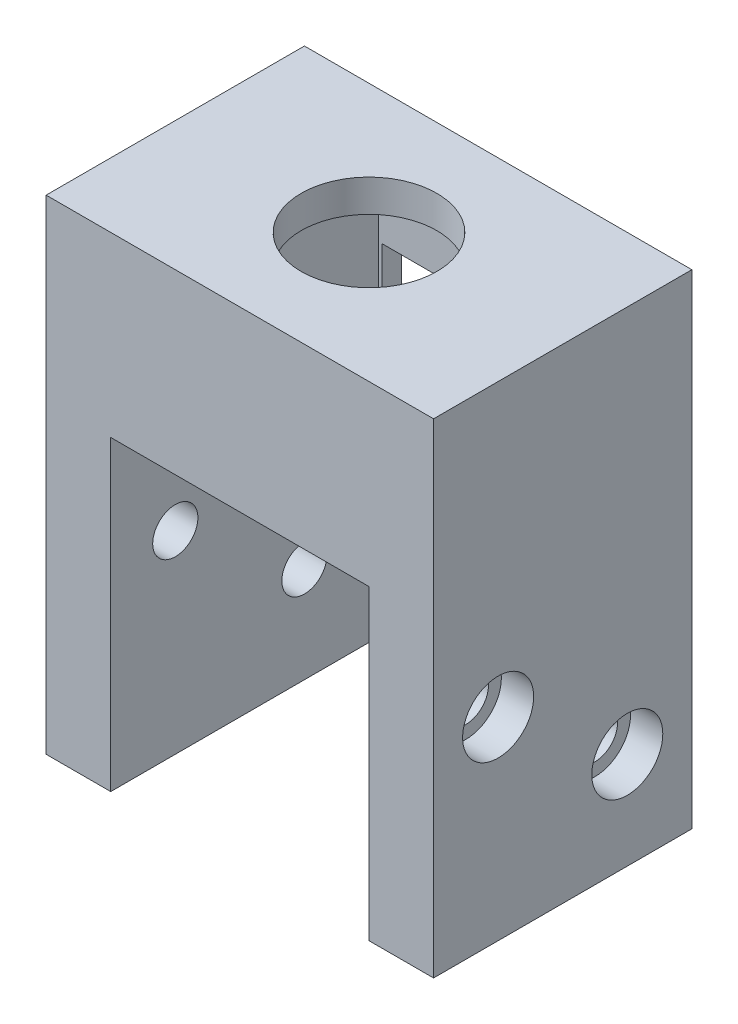
ISO-10303-21;
HEADER;
FILE_DESCRIPTION(('STEP AP214'),'2;1');
FILE_NAME('part.step','',(''),(''),'','','');
FILE_SCHEMA(('AUTOMOTIVE_DESIGN { 1 0 10303 214 1 1 1 1 }'));
ENDSEC;
DATA;
#1=APPLICATION_CONTEXT('core data for automotive mechanical design processes');
#2=APPLICATION_PROTOCOL_DEFINITION('international standard','automotive_design',2000,#1);
#3=PRODUCT_CONTEXT('',#1,'mechanical');
#4=PRODUCT('Part','Part','',(#3));
#5=PRODUCT_RELATED_PRODUCT_CATEGORY('part','',(#4));
#6=PRODUCT_DEFINITION_FORMATION('','',#4);
#7=PRODUCT_DEFINITION_CONTEXT('part definition',#1,'design');
#8=PRODUCT_DEFINITION('design','',#6,#7);
#9=PRODUCT_DEFINITION_SHAPE('','',#8);
#10=(LENGTH_UNIT() NAMED_UNIT(*) SI_UNIT(.MILLI.,.METRE.));
#11=(NAMED_UNIT(*) PLANE_ANGLE_UNIT() SI_UNIT($,.RADIAN.));
#12=(NAMED_UNIT(*) SI_UNIT($,.STERADIAN.) SOLID_ANGLE_UNIT());
#13=UNCERTAINTY_MEASURE_WITH_UNIT(LENGTH_MEASURE(1.E-05),#10,'distance_accuracy_value','');
#14=(GEOMETRIC_REPRESENTATION_CONTEXT(3) GLOBAL_UNCERTAINTY_ASSIGNED_CONTEXT((#13)) GLOBAL_UNIT_ASSIGNED_CONTEXT((#10,
#11,#12)) REPRESENTATION_CONTEXT('',''));
#15=CARTESIAN_POINT('',(0.,0.,0.));
#16=DIRECTION('',(0.,0.,1.));
#17=DIRECTION('',(1.,0.,0.));
#18=AXIS2_PLACEMENT_3D('',#15,#16,#17);
#19=CARTESIAN_POINT('',(-6.,-11.,-2.));
#20=DIRECTION('',(1.,0.,0.));
#21=DIRECTION('',(0.,0.,-1.));
#22=AXIS2_PLACEMENT_3D('',#19,#20,#21);
#23=CYLINDRICAL_SURFACE('',#22,0.699999999999999);
#24=CARTESIAN_POINT('',(4.,-11.,-2.));
#25=DIRECTION('',(-1.,0.,0.));
#26=DIRECTION('',(0.,0.,1.));
#27=AXIS2_PLACEMENT_3D('',#24,#25,#26);
#28=CIRCLE('',#27,0.699999999999999);
#29=CARTESIAN_POINT('',(4.,-11.,-1.3));
#30=VERTEX_POINT('',#29);
#31=EDGE_CURVE('E265',#30,#30,#28,.T.);
#32=ORIENTED_EDGE('',*,*,#31,.T.);
#33=EDGE_LOOP('',(#32));
#34=FACE_BOUND('',#33,.T.);
#35=CARTESIAN_POINT('',(5.,-11.,-2.));
#36=DIRECTION('',(1.,0.,0.));
#37=DIRECTION('',(0.,0.,-1.));
#38=AXIS2_PLACEMENT_3D('',#35,#36,#37);
#39=CIRCLE('',#38,0.699999999999999);
#40=CARTESIAN_POINT('',(5.,-11.,-2.7));
#41=VERTEX_POINT('',#40);
#42=EDGE_CURVE('E262',#41,#41,#39,.F.);
#43=ORIENTED_EDGE('',*,*,#42,.F.);
#44=EDGE_LOOP('',(#43));
#45=FACE_BOUND('',#44,.T.);
#46=ADVANCED_FACE('F50',(#34,#45),#23,.F.);
#47=CARTESIAN_POINT('',(-6.,-8.,2.));
#48=DIRECTION('',(1.,0.,0.));
#49=DIRECTION('',(0.,0.,-1.));
#50=AXIS2_PLACEMENT_3D('',#47,#48,#49);
#51=CYLINDRICAL_SURFACE('',#50,0.7);
#52=CARTESIAN_POINT('',(4.,-8.,2.));
#53=DIRECTION('',(-1.,0.,0.));
#54=DIRECTION('',(0.,0.,1.));
#55=AXIS2_PLACEMENT_3D('',#52,#53,#54);
#56=CIRCLE('',#55,0.7);
#57=CARTESIAN_POINT('',(4.,-8.,2.7));
#58=VERTEX_POINT('',#57);
#59=EDGE_CURVE('E302',#58,#58,#56,.T.);
#60=ORIENTED_EDGE('',*,*,#59,.T.);
#61=EDGE_LOOP('',(#60));
#62=FACE_BOUND('',#61,.T.);
#63=CARTESIAN_POINT('',(5.,-8.,2.));
#64=DIRECTION('',(1.,0.,0.));
#65=DIRECTION('',(0.,0.,-1.));
#66=AXIS2_PLACEMENT_3D('',#63,#64,#65);
#67=CIRCLE('',#66,0.7);
#68=CARTESIAN_POINT('',(5.,-8.,1.3));
#69=VERTEX_POINT('',#68);
#70=EDGE_CURVE('E259',#69,#69,#67,.F.);
#71=ORIENTED_EDGE('',*,*,#70,.F.);
#72=EDGE_LOOP('',(#71));
#73=FACE_BOUND('',#72,.T.);
#74=ADVANCED_FACE('F461',(#62,#73),#51,.F.);
#75=CARTESIAN_POINT('',(-4.,1.,-4.));
#76=DIRECTION('',(0.,0.,-1.));
#77=DIRECTION('',(-1.,0.,0.));
#78=AXIS2_PLACEMENT_3D('',#75,#76,#77);
#79=PLANE('',#78);
#80=DIRECTION('',(1.,0.,0.));
#81=VECTOR('',#80,1.);
#82=CARTESIAN_POINT('',(-4.53630188967935E-13,-4.49999999999274,-3.99999999999999));
#83=LINE('',#82,#81);
#84=CARTESIAN_POINT('',(3.,-4.49999999999162,-3.99999999999999));
#85=VERTEX_POINT('',#84);
#86=CARTESIAN_POINT('',(4.,-4.49999999999758,-4.));
#87=VERTEX_POINT('',#86);
#88=EDGE_CURVE('E213',#85,#87,#83,.T.);
#89=ORIENTED_EDGE('',*,*,#88,.F.);
#90=DIRECTION('',(0.,1.,0.));
#91=VECTOR('',#90,1.);
#92=CARTESIAN_POINT('',(3.,1.12410081243297E-12,-4.));
#93=LINE('',#92,#91);
#94=CARTESIAN_POINT('',(3.,-2.49999999999162,-4.));
#95=VERTEX_POINT('',#94);
#96=EDGE_CURVE('E196',#85,#95,#93,.T.);
#97=ORIENTED_EDGE('',*,*,#96,.T.);
#98=DIRECTION('',(-1.,0.,0.));
#99=VECTOR('',#98,1.);
#100=CARTESIAN_POINT('',(0.,-2.49999999999162,-4.));
#101=LINE('',#100,#99);
#102=CARTESIAN_POINT('',(1.39999999999993,-2.49999999999162,-4.));
#103=VERTEX_POINT('',#102);
#104=EDGE_CURVE('E206',#95,#103,#101,.T.);
#105=ORIENTED_EDGE('',*,*,#104,.T.);
#106=DIRECTION('',(0.,1.,0.));
#107=VECTOR('',#106,1.);
#108=CARTESIAN_POINT('',(1.4,1.12410081243297E-12,-4.));
#109=LINE('',#108,#107);
#110=CARTESIAN_POINT('',(1.4,-4.49999999999162,-4.));
#111=VERTEX_POINT('',#110);
#112=EDGE_CURVE('E189',#111,#103,#109,.T.);
#113=ORIENTED_EDGE('',*,*,#112,.F.);
#114=CARTESIAN_POINT('',(-1.4,-4.49999999999054,-3.99999999999945));
#115=VERTEX_POINT('',#114);
#116=EDGE_CURVE('E203',#115,#111,#83,.T.);
#117=ORIENTED_EDGE('',*,*,#116,.F.);
#118=DIRECTION('',(0.,1.,0.));
#119=VECTOR('',#118,1.);
#120=CARTESIAN_POINT('',(-1.4,2.2065682614425E-12,-4.));
#121=LINE('',#120,#119);
#122=CARTESIAN_POINT('',(-1.40000000000014,-2.49999999999054,-4.));
#123=VERTEX_POINT('',#122);
#124=EDGE_CURVE('E335',#115,#123,#121,.T.);
#125=ORIENTED_EDGE('',*,*,#124,.T.);
#126=DIRECTION('',(-1.,0.,0.));
#127=VECTOR('',#126,1.);
#128=CARTESIAN_POINT('',(-1.37910516340156E-13,-2.49999999999054,-4.));
#129=LINE('',#128,#127);
#130=CARTESIAN_POINT('',(-3.00000000000007,-2.49999999999054,-4.));
#131=VERTEX_POINT('',#130);
#132=EDGE_CURVE('E332',#123,#131,#129,.T.);
#133=ORIENTED_EDGE('',*,*,#132,.T.);
#134=DIRECTION('',(0.,1.,0.));
#135=VECTOR('',#134,1.);
#136=CARTESIAN_POINT('',(-3.00000000000007,2.2065682614425E-12,-4.));
#137=LINE('',#136,#135);
#138=CARTESIAN_POINT('',(-3.00000000000007,-4.49999999999054,-4.));
#139=VERTEX_POINT('',#138);
#140=EDGE_CURVE('E329',#139,#131,#137,.T.);
#141=ORIENTED_EDGE('',*,*,#140,.F.);
#142=CARTESIAN_POINT('',(-4.00000000000045,-4.49999999999274,-3.99999999999819));
#143=VERTEX_POINT('',#142);
#144=EDGE_CURVE('E212',#143,#139,#83,.T.);
#145=ORIENTED_EDGE('',*,*,#144,.F.);
#146=DIRECTION('',(0.,1.,0.));
#147=VECTOR('',#146,1.);
#148=CARTESIAN_POINT('',(-4.,-14.,-4.));
#149=LINE('',#148,#147);
#150=CARTESIAN_POINT('',(-4.,-14.,-4.));
#151=VERTEX_POINT('',#150);
#152=EDGE_CURVE('E387',#151,#143,#149,.T.);
#153=ORIENTED_EDGE('',*,*,#152,.F.);
#154=DIRECTION('',(1.,0.,0.));
#155=VECTOR('',#154,1.);
#156=CARTESIAN_POINT('',(0.,-14.,-3.99999999999999));
#157=LINE('',#156,#155);
#158=CARTESIAN_POINT('',(-6.,-14.,-4.));
#159=VERTEX_POINT('',#158);
#160=EDGE_CURVE('E375',#159,#151,#157,.T.);
#161=ORIENTED_EDGE('',*,*,#160,.F.);
#162=DIRECTION('',(0.,1.,0.));
#163=VECTOR('',#162,1.);
#164=CARTESIAN_POINT('',(-6.,-14.,-4.));
#165=LINE('',#164,#163);
#166=CARTESIAN_POINT('',(-6.,1.,-4.));
#167=VERTEX_POINT('',#166);
#168=EDGE_CURVE('E384',#159,#167,#165,.T.);
#169=ORIENTED_EDGE('',*,*,#168,.T.);
#170=DIRECTION('',(1.,0.,0.));
#171=VECTOR('',#170,1.);
#172=CARTESIAN_POINT('',(-4.,1.,-4.));
#173=LINE('',#172,#171);
#174=CARTESIAN_POINT('',(6.,1.,-4.));
#175=VERTEX_POINT('',#174);
#176=EDGE_CURVE('E12',#167,#175,#173,.T.);
#177=ORIENTED_EDGE('',*,*,#176,.T.);
#178=DIRECTION('',(0.,1.,0.));
#179=VECTOR('',#178,1.);
#180=CARTESIAN_POINT('',(6.,-14.,-4.));
#181=LINE('',#180,#179);
#182=CARTESIAN_POINT('',(6.,-14.,-4.));
#183=VERTEX_POINT('',#182);
#184=EDGE_CURVE('E361',#183,#175,#181,.T.);
#185=ORIENTED_EDGE('',*,*,#184,.F.);
#186=DIRECTION('',(-1.,0.,0.));
#187=VECTOR('',#186,1.);
#188=CARTESIAN_POINT('',(0.,-14.,-3.99999999999999));
#189=LINE('',#188,#187);
#190=CARTESIAN_POINT('',(4.,-14.,-4.));
#191=VERTEX_POINT('',#190);
#192=EDGE_CURVE('E350',#183,#191,#189,.T.);
#193=ORIENTED_EDGE('',*,*,#192,.T.);
#194=DIRECTION('',(0.,1.,0.));
#195=VECTOR('',#194,1.);
#196=CARTESIAN_POINT('',(4.,-14.,-4.));
#197=LINE('',#196,#195);
#198=EDGE_CURVE('E364',#191,#87,#197,.T.);
#199=ORIENTED_EDGE('',*,*,#198,.T.);
#200=EDGE_LOOP('',(#89,#97,#105,#113,#117,#125,#133,#141,#145,#153,#161,#169,#177,#185,#193,#199));
#201=FACE_BOUND('',#200,.T.);
#202=ADVANCED_FACE('F201',(#201),#79,.T.);
#203=CARTESIAN_POINT('',(0.,-4.5,-3.39999999999999));
#204=DIRECTION('',(0.,0.,-1.));
#205=DIRECTION('',(-1.,0.,0.));
#206=AXIS2_PLACEMENT_3D('',#203,#204,#205);
#207=PLANE('',#206);
#208=DIRECTION('',(0.,-1.,0.));
#209=VECTOR('',#208,1.);
#210=CARTESIAN_POINT('',(3.,1.12410081243297E-12,-3.39999999999999));
#211=LINE('',#210,#209);
#212=CARTESIAN_POINT('',(3.,-2.49999999999162,-3.39999999999999));
#213=VERTEX_POINT('',#212);
#214=CARTESIAN_POINT('',(3.,-4.49999999999162,-3.4));
#215=VERTEX_POINT('',#214);
#216=EDGE_CURVE('E207',#213,#215,#211,.T.);
#217=ORIENTED_EDGE('',*,*,#216,.T.);
#218=DIRECTION('',(-1.,0.,0.));
#219=VECTOR('',#218,1.);
#220=CARTESIAN_POINT('',(0.,-4.5,-3.39999999999999));
#221=LINE('',#220,#219);
#222=CARTESIAN_POINT('',(3.1,-4.5,-3.4));
#223=VERTEX_POINT('',#222);
#224=EDGE_CURVE('E394',#223,#215,#221,.T.);
#225=ORIENTED_EDGE('',*,*,#224,.F.);
#226=DIRECTION('',(0.,1.,0.));
#227=VECTOR('',#226,1.);
#228=CARTESIAN_POINT('',(3.1,-4.5,-3.4));
#229=LINE('',#228,#227);
#230=CARTESIAN_POINT('',(3.1,0.,-3.4));
#231=VERTEX_POINT('',#230);
#232=EDGE_CURVE('E250',#223,#231,#229,.T.);
#233=ORIENTED_EDGE('',*,*,#232,.T.);
#234=DIRECTION('',(-1.,0.,0.));
#235=VECTOR('',#234,1.);
#236=CARTESIAN_POINT('',(0.,0.,-3.39999999999999));
#237=LINE('',#236,#235);
#238=CARTESIAN_POINT('',(-3.10000000000019,0.,-3.4));
#239=VERTEX_POINT('',#238);
#240=EDGE_CURVE('E233',#231,#239,#237,.T.);
#241=ORIENTED_EDGE('',*,*,#240,.T.);
#242=DIRECTION('',(0.,1.,0.));
#243=VECTOR('',#242,1.);
#244=CARTESIAN_POINT('',(-3.10000000000019,-4.5,-3.4));
#245=LINE('',#244,#243);
#246=CARTESIAN_POINT('',(-3.10000000000019,-4.5,-3.4));
#247=VERTEX_POINT('',#246);
#248=EDGE_CURVE('E248',#247,#239,#245,.T.);
#249=ORIENTED_EDGE('',*,*,#248,.F.);
#250=CARTESIAN_POINT('',(-3.00000000000007,-4.5,-3.39999999999999));
#251=VERTEX_POINT('',#250);
#252=EDGE_CURVE('E393',#251,#247,#221,.T.);
#253=ORIENTED_EDGE('',*,*,#252,.F.);
#254=DIRECTION('',(0.,-1.,0.));
#255=VECTOR('',#254,1.);
#256=CARTESIAN_POINT('',(-3.00000000000007,2.2065682614425E-12,-3.39999999999999));
#257=LINE('',#256,#255);
#258=CARTESIAN_POINT('',(-3.00000000000007,-2.49999999999054,-3.39999999999999));
#259=VERTEX_POINT('',#258);
#260=EDGE_CURVE('E67',#259,#251,#257,.T.);
#261=ORIENTED_EDGE('',*,*,#260,.F.);
#262=DIRECTION('',(1.,0.,0.));
#263=VECTOR('',#262,1.);
#264=CARTESIAN_POINT('',(-1.37108098312313E-13,-2.49999999999054,-3.39999999999999));
#265=LINE('',#264,#263);
#266=CARTESIAN_POINT('',(-1.40000000000014,-2.49999999999054,-3.39999999999999));
#267=VERTEX_POINT('',#266);
#268=EDGE_CURVE('E308',#259,#267,#265,.T.);
#269=ORIENTED_EDGE('',*,*,#268,.T.);
#270=DIRECTION('',(0.,-1.,0.));
#271=VECTOR('',#270,1.);
#272=CARTESIAN_POINT('',(-1.4,2.2065682614425E-12,-3.39999999999999));
#273=LINE('',#272,#271);
#274=CARTESIAN_POINT('',(-1.4,-4.49999999999054,-3.4));
#275=VERTEX_POINT('',#274);
#276=EDGE_CURVE('E326',#267,#275,#273,.T.);
#277=ORIENTED_EDGE('',*,*,#276,.T.);
#278=CARTESIAN_POINT('',(1.4,-4.5,-3.39999999999999));
#279=VERTEX_POINT('',#278);
#280=EDGE_CURVE('E397',#279,#275,#221,.T.);
#281=ORIENTED_EDGE('',*,*,#280,.F.);
#282=DIRECTION('',(0.,-1.,0.));
#283=VECTOR('',#282,1.);
#284=CARTESIAN_POINT('',(1.4,1.12410081243297E-12,-3.39999999999999));
#285=LINE('',#284,#283);
#286=CARTESIAN_POINT('',(1.39999999999993,-2.49999999999162,-3.39999999999999));
#287=VERTEX_POINT('',#286);
#288=EDGE_CURVE('E75',#287,#279,#285,.T.);
#289=ORIENTED_EDGE('',*,*,#288,.F.);
#290=DIRECTION('',(1.,0.,0.));
#291=VECTOR('',#290,1.);
#292=CARTESIAN_POINT('',(0.,-2.49999999999162,-3.39999999999999));
#293=LINE('',#292,#291);
#294=EDGE_CURVE('E309',#287,#213,#293,.T.);
#295=ORIENTED_EDGE('',*,*,#294,.T.);
#296=EDGE_LOOP('',(#217,#225,#233,#241,#249,#253,#261,#269,#277,#281,#289,#295));
#297=FACE_BOUND('',#296,.T.);
#298=ADVANCED_FACE('F413',(#297),#207,.F.);
#299=CARTESIAN_POINT('',(0.,-4.5,0.));
#300=DIRECTION('',(0.,-1.,0.));
#301=DIRECTION('',(0.,0.,-1.));
#302=AXIS2_PLACEMENT_3D('',#299,#300,#301);
#303=PLANE('',#302);
#304=ORIENTED_EDGE('',*,*,#224,.T.);
#305=DIRECTION('',(0.,0.,-1.));
#306=VECTOR('',#305,1.);
#307=CARTESIAN_POINT('',(3.,-4.49999999999162,4.001));
#308=LINE('',#307,#306);
#309=EDGE_CURVE('E316',#215,#85,#308,.T.);
#310=ORIENTED_EDGE('',*,*,#309,.T.);
#311=ORIENTED_EDGE('',*,*,#88,.T.);
#312=DIRECTION('',(0.,0.,1.));
#313=VECTOR('',#312,1.);
#314=CARTESIAN_POINT('',(4.,-4.5,3.57353036051222E-13));
#315=LINE('',#314,#313);
#316=CARTESIAN_POINT('',(4.,-4.5,4.));
#317=VERTEX_POINT('',#316);
#318=EDGE_CURVE('E216',#87,#317,#315,.T.);
#319=ORIENTED_EDGE('',*,*,#318,.T.);
#320=DIRECTION('',(-1.,0.,0.));
#321=VECTOR('',#320,1.);
#322=CARTESIAN_POINT('',(0.,-4.5,4.));
#323=LINE('',#322,#321);
#324=CARTESIAN_POINT('',(-4.,-4.49999999999637,4.));
#325=VERTEX_POINT('',#324);
#326=EDGE_CURVE('E223',#317,#325,#323,.T.);
#327=ORIENTED_EDGE('',*,*,#326,.T.);
#328=DIRECTION('',(0.,0.,-1.));
#329=VECTOR('',#328,1.);
#330=CARTESIAN_POINT('',(-4.,-4.5,0.));
#331=LINE('',#330,#329);
#332=EDGE_CURVE('E226',#325,#143,#331,.T.);
#333=ORIENTED_EDGE('',*,*,#332,.T.);
#334=ORIENTED_EDGE('',*,*,#144,.T.);
#335=DIRECTION('',(0.,0.,-1.));
#336=VECTOR('',#335,1.);
#337=CARTESIAN_POINT('',(-3.00000000000007,-4.49999999999054,4.001));
#338=LINE('',#337,#336);
#339=EDGE_CURVE('E337',#251,#139,#338,.T.);
#340=ORIENTED_EDGE('',*,*,#339,.F.);
#341=ORIENTED_EDGE('',*,*,#252,.T.);
#342=DIRECTION('',(0.,0.,-1.));
#343=VECTOR('',#342,1.);
#344=CARTESIAN_POINT('',(-3.10000000000023,-4.5,9.22872889219661E-13));
#345=LINE('',#344,#343);
#346=CARTESIAN_POINT('',(-3.10000000000006,-4.5,3.40000000000026));
#347=VERTEX_POINT('',#346);
#348=EDGE_CURVE('E396',#347,#247,#345,.T.);
#349=ORIENTED_EDGE('',*,*,#348,.F.);
#350=DIRECTION('',(-1.,0.,0.));
#351=VECTOR('',#350,1.);
#352=CARTESIAN_POINT('',(0.,-4.5,3.4));
#353=LINE('',#352,#351);
#354=CARTESIAN_POINT('',(3.1,-4.5,3.4));
#355=VERTEX_POINT('',#354);
#356=EDGE_CURVE('E217',#355,#347,#353,.T.);
#357=ORIENTED_EDGE('',*,*,#356,.F.);
#358=DIRECTION('',(0.,0.,-1.));
#359=VECTOR('',#358,1.);
#360=CARTESIAN_POINT('',(3.1,-4.5,0.));
#361=LINE('',#360,#359);
#362=EDGE_CURVE('E243',#355,#223,#361,.T.);
#363=ORIENTED_EDGE('',*,*,#362,.T.);
#364=EDGE_LOOP('',(#304,#310,#311,#319,#327,#333,#334,#340,#341,#349,#357,#363));
#365=FACE_BOUND('',#364,.T.);
#366=ADVANCED_FACE('F408',(#365),#303,.T.);
#367=DIRECTION('',(0.,0.,-1.));
#368=VECTOR('',#367,1.);
#369=CARTESIAN_POINT('',(1.4,-4.49999999999162,4.001));
#370=LINE('',#369,#368);
#371=EDGE_CURVE('E186',#279,#111,#370,.T.);
#372=ORIENTED_EDGE('',*,*,#371,.F.);
#373=ORIENTED_EDGE('',*,*,#280,.T.);
#374=DIRECTION('',(0.,0.,-1.));
#375=VECTOR('',#374,1.);
#376=CARTESIAN_POINT('',(-1.4,-4.49999999999054,4.00100000000055));
#377=LINE('',#376,#375);
#378=EDGE_CURVE('E211',#275,#115,#377,.T.);
#379=ORIENTED_EDGE('',*,*,#378,.T.);
#380=ORIENTED_EDGE('',*,*,#116,.T.);
#381=EDGE_LOOP('',(#372,#373,#379,#380));
#382=FACE_BOUND('',#381,.T.);
#383=ADVANCED_FACE('F210',(#382),#303,.T.);
#384=CARTESIAN_POINT('',(0.,0.,0.));
#385=DIRECTION('',(0.,1.,0.));
#386=DIRECTION('',(0.,0.,1.));
#387=AXIS2_PLACEMENT_3D('',#384,#385,#386);
#388=PLANE('',#387);
#389=CARTESIAN_POINT('',(0.,0.,0.));
#390=DIRECTION('',(0.,1.,0.));
#391=DIRECTION('',(0.,0.,1.));
#392=AXIS2_PLACEMENT_3D('',#389,#390,#391);
#393=CIRCLE('',#392,2.1);
#394=CARTESIAN_POINT('',(0.,0.,2.1));
#395=VERTEX_POINT('',#394);
#396=EDGE_CURVE('E252',#395,#395,#393,.T.);
#397=ORIENTED_EDGE('',*,*,#396,.T.);
#398=EDGE_LOOP('',(#397));
#399=FACE_BOUND('',#398,.T.);
#400=DIRECTION('',(0.,0.,-1.));
#401=VECTOR('',#400,1.);
#402=CARTESIAN_POINT('',(3.1,0.,0.));
#403=LINE('',#402,#401);
#404=CARTESIAN_POINT('',(3.1,0.,3.4));
#405=VERTEX_POINT('',#404);
#406=EDGE_CURVE('E230',#405,#231,#403,.T.);
#407=ORIENTED_EDGE('',*,*,#406,.F.);
#408=DIRECTION('',(-1.,0.,0.));
#409=VECTOR('',#408,1.);
#410=CARTESIAN_POINT('',(0.,0.,3.4));
#411=LINE('',#410,#409);
#412=CARTESIAN_POINT('',(-3.10000000000006,0.,3.4));
#413=VERTEX_POINT('',#412);
#414=EDGE_CURVE('E240',#405,#413,#411,.T.);
#415=ORIENTED_EDGE('',*,*,#414,.T.);
#416=DIRECTION('',(0.,0.,-1.));
#417=VECTOR('',#416,1.);
#418=CARTESIAN_POINT('',(-3.10000000000023,0.,9.22872889219661E-13));
#419=LINE('',#418,#417);
#420=EDGE_CURVE('E237',#413,#239,#419,.T.);
#421=ORIENTED_EDGE('',*,*,#420,.T.);
#422=ORIENTED_EDGE('',*,*,#240,.F.);
#423=EDGE_LOOP('',(#407,#415,#421,#422));
#424=FACE_BOUND('',#423,.T.);
#425=ADVANCED_FACE('F418',(#399,#424),#388,.F.);
#426=CARTESIAN_POINT('',(0.,1.,0.));
#427=DIRECTION('',(0.,1.,0.));
#428=DIRECTION('',(0.,0.,1.));
#429=AXIS2_PLACEMENT_3D('',#426,#427,#428);
#430=PLANE('',#429);
#431=DIRECTION('',(1.,0.,0.));
#432=VECTOR('',#431,1.);
#433=CARTESIAN_POINT('',(-4.,1.,4.));
#434=LINE('',#433,#432);
#435=CARTESIAN_POINT('',(-6.,1.,4.));
#436=VERTEX_POINT('',#435);
#437=CARTESIAN_POINT('',(6.,1.,4.));
#438=VERTEX_POINT('',#437);
#439=EDGE_CURVE('E59',#436,#438,#434,.T.);
#440=ORIENTED_EDGE('',*,*,#439,.T.);
#441=DIRECTION('',(0.,0.,-1.));
#442=VECTOR('',#441,1.);
#443=CARTESIAN_POINT('',(6.,1.,0.));
#444=LINE('',#443,#442);
#445=EDGE_CURVE('E323',#438,#175,#444,.T.);
#446=ORIENTED_EDGE('',*,*,#445,.T.);
#447=ORIENTED_EDGE('',*,*,#176,.F.);
#448=DIRECTION('',(0.,0.,-1.));
#449=VECTOR('',#448,1.);
#450=CARTESIAN_POINT('',(-6.,1.,0.));
#451=LINE('',#450,#449);
#452=EDGE_CURVE('E369',#436,#167,#451,.T.);
#453=ORIENTED_EDGE('',*,*,#452,.F.);
#454=EDGE_LOOP('',(#440,#446,#447,#453));
#455=FACE_BOUND('',#454,.T.);
#456=CARTESIAN_POINT('',(0.,1.,0.));
#457=DIRECTION('',(0.,1.,0.));
#458=DIRECTION('',(0.,0.,1.));
#459=AXIS2_PLACEMENT_3D('',#456,#457,#458);
#460=CIRCLE('',#459,2.1);
#461=CARTESIAN_POINT('',(0.,1.,2.1));
#462=VERTEX_POINT('',#461);
#463=EDGE_CURVE('E253',#462,#462,#460,.T.);
#464=ORIENTED_EDGE('',*,*,#463,.F.);
#465=EDGE_LOOP('',(#464));
#466=FACE_BOUND('',#465,.T.);
#467=ADVANCED_FACE('F514',(#455,#466),#430,.T.);
#468=CARTESIAN_POINT('',(-4.,1.,4.));
#469=DIRECTION('',(0.,0.,-1.));
#470=DIRECTION('',(-1.,0.,0.));
#471=AXIS2_PLACEMENT_3D('',#468,#469,#470);
#472=PLANE('',#471);
#473=ORIENTED_EDGE('',*,*,#439,.F.);
#474=DIRECTION('',(0.,1.,0.));
#475=VECTOR('',#474,1.);
#476=CARTESIAN_POINT('',(-6.,-14.,4.));
#477=LINE('',#476,#475);
#478=CARTESIAN_POINT('',(-6.,-14.,4.));
#479=VERTEX_POINT('',#478);
#480=EDGE_CURVE('E234',#479,#436,#477,.T.);
#481=ORIENTED_EDGE('',*,*,#480,.F.);
#482=DIRECTION('',(1.,0.,0.));
#483=VECTOR('',#482,1.);
#484=CARTESIAN_POINT('',(0.,-14.,4.));
#485=LINE('',#484,#483);
#486=CARTESIAN_POINT('',(-4.,-14.,4.));
#487=VERTEX_POINT('',#486);
#488=EDGE_CURVE('E370',#479,#487,#485,.T.);
#489=ORIENTED_EDGE('',*,*,#488,.T.);
#490=DIRECTION('',(0.,1.,0.));
#491=VECTOR('',#490,1.);
#492=CARTESIAN_POINT('',(-4.,-14.,4.));
#493=LINE('',#492,#491);
#494=EDGE_CURVE('E379',#487,#325,#493,.T.);
#495=ORIENTED_EDGE('',*,*,#494,.T.);
#496=ORIENTED_EDGE('',*,*,#326,.F.);
#497=DIRECTION('',(0.,1.,0.));
#498=VECTOR('',#497,1.);
#499=CARTESIAN_POINT('',(4.,-14.,4.));
#500=LINE('',#499,#498);
#501=CARTESIAN_POINT('',(4.,-14.,4.));
#502=VERTEX_POINT('',#501);
#503=EDGE_CURVE('E367',#502,#317,#500,.T.);
#504=ORIENTED_EDGE('',*,*,#503,.F.);
#505=DIRECTION('',(-1.,0.,0.));
#506=VECTOR('',#505,1.);
#507=CARTESIAN_POINT('',(0.,-14.,4.));
#508=LINE('',#507,#506);
#509=CARTESIAN_POINT('',(6.,-14.,4.));
#510=VERTEX_POINT('',#509);
#511=EDGE_CURVE('E345',#510,#502,#508,.T.);
#512=ORIENTED_EDGE('',*,*,#511,.F.);
#513=DIRECTION('',(0.,1.,0.));
#514=VECTOR('',#513,1.);
#515=CARTESIAN_POINT('',(6.,-14.,4.));
#516=LINE('',#515,#514);
#517=EDGE_CURVE('E356',#510,#438,#516,.T.);
#518=ORIENTED_EDGE('',*,*,#517,.T.);
#519=EDGE_LOOP('',(#473,#481,#489,#495,#496,#504,#512,#518));
#520=FACE_BOUND('',#519,.T.);
#521=ADVANCED_FACE('F52',(#520),#472,.F.);
#522=CARTESIAN_POINT('',(0.,1.,0.));
#523=DIRECTION('',(0.,-1.,0.));
#524=DIRECTION('',(0.,0.,-1.));
#525=AXIS2_PLACEMENT_3D('',#522,#523,#524);
#526=CYLINDRICAL_SURFACE('',#525,2.1);
#527=ORIENTED_EDGE('',*,*,#463,.T.);
#528=EDGE_LOOP('',(#527));
#529=FACE_BOUND('',#528,.T.);
#530=ORIENTED_EDGE('',*,*,#396,.F.);
#531=EDGE_LOOP('',(#530));
#532=FACE_BOUND('',#531,.T.);
#533=ADVANCED_FACE('F510',(#529,#532),#526,.F.);
#534=CARTESIAN_POINT('',(3.1,-4.5,0.));
#535=DIRECTION('',(1.,0.,0.));
#536=DIRECTION('',(0.,0.,-1.));
#537=AXIS2_PLACEMENT_3D('',#534,#535,#536);
#538=PLANE('',#537);
#539=ORIENTED_EDGE('',*,*,#406,.T.);
#540=ORIENTED_EDGE('',*,*,#232,.F.);
#541=ORIENTED_EDGE('',*,*,#362,.F.);
#542=DIRECTION('',(0.,1.,0.));
#543=VECTOR('',#542,1.);
#544=CARTESIAN_POINT('',(3.1,-4.5,3.4));
#545=LINE('',#544,#543);
#546=EDGE_CURVE('E229',#355,#405,#545,.T.);
#547=ORIENTED_EDGE('',*,*,#546,.T.);
#548=EDGE_LOOP('',(#539,#540,#541,#547));
#549=FACE_BOUND('',#548,.T.);
#550=ADVANCED_FACE('F420',(#549),#538,.F.);
#551=CARTESIAN_POINT('',(-3.10000000000023,-4.5,9.22872889219661E-13));
#552=DIRECTION('',(1.,0.,0.));
#553=DIRECTION('',(0.,0.,-1.));
#554=AXIS2_PLACEMENT_3D('',#551,#552,#553);
#555=PLANE('',#554);
#556=ORIENTED_EDGE('',*,*,#420,.F.);
#557=DIRECTION('',(0.,1.,0.));
#558=VECTOR('',#557,1.);
#559=CARTESIAN_POINT('',(-3.10000000000006,-4.5,3.40000000000026));
#560=LINE('',#559,#558);
#561=EDGE_CURVE('E245',#347,#413,#560,.T.);
#562=ORIENTED_EDGE('',*,*,#561,.F.);
#563=ORIENTED_EDGE('',*,*,#348,.T.);
#564=ORIENTED_EDGE('',*,*,#248,.T.);
#565=EDGE_LOOP('',(#556,#562,#563,#564));
#566=FACE_BOUND('',#565,.T.);
#567=ADVANCED_FACE('F415',(#566),#555,.T.);
#568=CARTESIAN_POINT('',(0.,-4.5,3.4));
#569=DIRECTION('',(0.,0.,-1.));
#570=DIRECTION('',(-1.,0.,0.));
#571=AXIS2_PLACEMENT_3D('',#568,#569,#570);
#572=PLANE('',#571);
#573=ORIENTED_EDGE('',*,*,#414,.F.);
#574=ORIENTED_EDGE('',*,*,#546,.F.);
#575=ORIENTED_EDGE('',*,*,#356,.T.);
#576=ORIENTED_EDGE('',*,*,#561,.T.);
#577=EDGE_LOOP('',(#573,#574,#575,#576));
#578=FACE_BOUND('',#577,.T.);
#579=ADVANCED_FACE('F405',(#578),#572,.T.);
#580=CARTESIAN_POINT('',(-6.,-14.,0.));
#581=DIRECTION('',(1.,0.,0.));
#582=DIRECTION('',(0.,0.,-1.));
#583=AXIS2_PLACEMENT_3D('',#580,#581,#582);
#584=PLANE('',#583);
#585=CARTESIAN_POINT('',(-6.,-8.,2.));
#586=DIRECTION('',(1.,0.,0.));
#587=DIRECTION('',(0.,0.,-1.));
#588=AXIS2_PLACEMENT_3D('',#585,#586,#587);
#589=CIRCLE('',#588,1.1);
#590=CARTESIAN_POINT('',(-6.,-8.,0.899999999999997));
#591=VERTEX_POINT('',#590);
#592=EDGE_CURVE('E274',#591,#591,#589,.T.);
#593=ORIENTED_EDGE('',*,*,#592,.T.);
#594=EDGE_LOOP('',(#593));
#595=FACE_BOUND('',#594,.T.);
#596=CARTESIAN_POINT('',(-6.,-11.,-2.));
#597=DIRECTION('',(1.,0.,0.));
#598=DIRECTION('',(0.,0.,-1.));
#599=AXIS2_PLACEMENT_3D('',#596,#597,#598);
#600=CIRCLE('',#599,1.1);
#601=CARTESIAN_POINT('',(-6.,-11.,-3.1));
#602=VERTEX_POINT('',#601);
#603=EDGE_CURVE('E279',#602,#602,#600,.T.);
#604=ORIENTED_EDGE('',*,*,#603,.T.);
#605=EDGE_LOOP('',(#604));
#606=FACE_BOUND('',#605,.T.);
#607=ORIENTED_EDGE('',*,*,#452,.T.);
#608=ORIENTED_EDGE('',*,*,#168,.F.);
#609=DIRECTION('',(0.,0.,-1.));
#610=VECTOR('',#609,1.);
#611=CARTESIAN_POINT('',(-6.,-14.,0.));
#612=LINE('',#611,#610);
#613=EDGE_CURVE('E377',#479,#159,#612,.T.);
#614=ORIENTED_EDGE('',*,*,#613,.F.);
#615=ORIENTED_EDGE('',*,*,#480,.T.);
#616=EDGE_LOOP('',(#607,#608,#614,#615));
#617=FACE_BOUND('',#616,.T.);
#618=ADVANCED_FACE('F488',(#595,#606,#617),#584,.F.);
#619=CARTESIAN_POINT('',(-4.,-14.,0.));
#620=DIRECTION('',(-1.,0.,0.));
#621=DIRECTION('',(0.,0.,1.));
#622=AXIS2_PLACEMENT_3D('',#619,#620,#621);
#623=PLANE('',#622);
#624=CARTESIAN_POINT('',(-4.,-8.,2.));
#625=DIRECTION('',(-1.,0.,0.));
#626=DIRECTION('',(0.,0.,1.));
#627=AXIS2_PLACEMENT_3D('',#624,#625,#626);
#628=CIRCLE('',#627,0.7);
#629=CARTESIAN_POINT('',(-4.,-8.,2.7));
#630=VERTEX_POINT('',#629);
#631=EDGE_CURVE('E305',#630,#630,#628,.T.);
#632=ORIENTED_EDGE('',*,*,#631,.T.);
#633=EDGE_LOOP('',(#632));
#634=FACE_BOUND('',#633,.T.);
#635=CARTESIAN_POINT('',(-4.,-11.,-2.));
#636=DIRECTION('',(-1.,0.,0.));
#637=DIRECTION('',(0.,0.,1.));
#638=AXIS2_PLACEMENT_3D('',#635,#636,#637);
#639=CIRCLE('',#638,0.699999999999999);
#640=CARTESIAN_POINT('',(-4.,-11.,-1.3));
#641=VERTEX_POINT('',#640);
#642=EDGE_CURVE('E299',#641,#641,#639,.T.);
#643=ORIENTED_EDGE('',*,*,#642,.T.);
#644=EDGE_LOOP('',(#643));
#645=FACE_BOUND('',#644,.T.);
#646=ORIENTED_EDGE('',*,*,#332,.F.);
#647=ORIENTED_EDGE('',*,*,#494,.F.);
#648=DIRECTION('',(0.,0.,1.));
#649=VECTOR('',#648,1.);
#650=CARTESIAN_POINT('',(-4.,-14.,0.));
#651=LINE('',#650,#649);
#652=EDGE_CURVE('E373',#151,#487,#651,.T.);
#653=ORIENTED_EDGE('',*,*,#652,.F.);
#654=ORIENTED_EDGE('',*,*,#152,.T.);
#655=EDGE_LOOP('',(#646,#647,#653,#654));
#656=FACE_BOUND('',#655,.T.);
#657=ADVANCED_FACE('F485',(#634,#645,#656),#623,.F.);
#658=CARTESIAN_POINT('',(0.,-14.,0.));
#659=DIRECTION('',(0.,-1.,0.));
#660=DIRECTION('',(0.,0.,-1.));
#661=AXIS2_PLACEMENT_3D('',#658,#659,#660);
#662=PLANE('',#661);
#663=ORIENTED_EDGE('',*,*,#488,.F.);
#664=ORIENTED_EDGE('',*,*,#613,.T.);
#665=ORIENTED_EDGE('',*,*,#160,.T.);
#666=ORIENTED_EDGE('',*,*,#652,.T.);
#667=EDGE_LOOP('',(#663,#664,#665,#666));
#668=FACE_BOUND('',#667,.T.);
#669=ADVANCED_FACE('F487',(#668),#662,.T.);
#670=CARTESIAN_POINT('',(4.,-14.,0.));
#671=DIRECTION('',(-1.,0.,0.));
#672=DIRECTION('',(0.,0.,1.));
#673=AXIS2_PLACEMENT_3D('',#670,#671,#672);
#674=PLANE('',#673);
#675=ORIENTED_EDGE('',*,*,#59,.F.);
#676=EDGE_LOOP('',(#675));
#677=FACE_BOUND('',#676,.T.);
#678=ORIENTED_EDGE('',*,*,#31,.F.);
#679=EDGE_LOOP('',(#678));
#680=FACE_BOUND('',#679,.T.);
#681=ORIENTED_EDGE('',*,*,#318,.F.);
#682=ORIENTED_EDGE('',*,*,#198,.F.);
#683=DIRECTION('',(0.,0.,1.));
#684=VECTOR('',#683,1.);
#685=CARTESIAN_POINT('',(4.,-14.,0.));
#686=LINE('',#685,#684);
#687=EDGE_CURVE('E347',#191,#502,#686,.T.);
#688=ORIENTED_EDGE('',*,*,#687,.T.);
#689=ORIENTED_EDGE('',*,*,#503,.T.);
#690=EDGE_LOOP('',(#681,#682,#688,#689));
#691=FACE_BOUND('',#690,.T.);
#692=ADVANCED_FACE('F427',(#677,#680,#691),#674,.T.);
#693=CARTESIAN_POINT('',(6.,-14.,0.));
#694=DIRECTION('',(1.,0.,0.));
#695=DIRECTION('',(0.,0.,-1.));
#696=AXIS2_PLACEMENT_3D('',#693,#694,#695);
#697=PLANE('',#696);
#698=CARTESIAN_POINT('',(6.,-8.,2.));
#699=DIRECTION('',(1.,0.,0.));
#700=DIRECTION('',(0.,0.,-1.));
#701=AXIS2_PLACEMENT_3D('',#698,#699,#700);
#702=CIRCLE('',#701,1.1);
#703=CARTESIAN_POINT('',(6.,-8.,0.9));
#704=VERTEX_POINT('',#703);
#705=EDGE_CURVE('E289',#704,#704,#702,.T.);
#706=ORIENTED_EDGE('',*,*,#705,.F.);
#707=EDGE_LOOP('',(#706));
#708=FACE_BOUND('',#707,.T.);
#709=CARTESIAN_POINT('',(6.,-11.,-2.));
#710=DIRECTION('',(1.,0.,0.));
#711=DIRECTION('',(0.,0.,-1.));
#712=AXIS2_PLACEMENT_3D('',#709,#710,#711);
#713=CIRCLE('',#712,1.1);
#714=CARTESIAN_POINT('',(6.,-11.,-3.1));
#715=VERTEX_POINT('',#714);
#716=EDGE_CURVE('E292',#715,#715,#713,.T.);
#717=ORIENTED_EDGE('',*,*,#716,.F.);
#718=EDGE_LOOP('',(#717));
#719=FACE_BOUND('',#718,.T.);
#720=ORIENTED_EDGE('',*,*,#445,.F.);
#721=ORIENTED_EDGE('',*,*,#517,.F.);
#722=DIRECTION('',(0.,0.,-1.));
#723=VECTOR('',#722,1.);
#724=CARTESIAN_POINT('',(6.,-14.,0.));
#725=LINE('',#724,#723);
#726=EDGE_CURVE('E353',#510,#183,#725,.T.);
#727=ORIENTED_EDGE('',*,*,#726,.T.);
#728=ORIENTED_EDGE('',*,*,#184,.T.);
#729=EDGE_LOOP('',(#720,#721,#727,#728));
#730=FACE_BOUND('',#729,.T.);
#731=ADVANCED_FACE('F457',(#708,#719,#730),#697,.T.);
#732=CARTESIAN_POINT('',(0.,-14.,0.));
#733=DIRECTION('',(0.,1.,0.));
#734=DIRECTION('',(0.,0.,1.));
#735=AXIS2_PLACEMENT_3D('',#732,#733,#734);
#736=PLANE('',#735);
#737=ORIENTED_EDGE('',*,*,#511,.T.);
#738=ORIENTED_EDGE('',*,*,#687,.F.);
#739=ORIENTED_EDGE('',*,*,#192,.F.);
#740=ORIENTED_EDGE('',*,*,#726,.F.);
#741=EDGE_LOOP('',(#737,#738,#739,#740));
#742=FACE_BOUND('',#741,.T.);
#743=ADVANCED_FACE('F429',(#742),#736,.F.);
#744=CARTESIAN_POINT('',(-1.4,2.2065682614425E-12,4.001));
#745=DIRECTION('',(-1.,0.,0.));
#746=DIRECTION('',(0.,-1.,0.));
#747=AXIS2_PLACEMENT_3D('',#744,#745,#746);
#748=PLANE('',#747);
#749=DIRECTION('',(0.,0.,-1.));
#750=VECTOR('',#749,1.);
#751=CARTESIAN_POINT('',(-1.40000000000014,-2.49999999999054,4.001));
#752=LINE('',#751,#750);
#753=EDGE_CURVE('E339',#267,#123,#752,.T.);
#754=ORIENTED_EDGE('',*,*,#753,.T.);
#755=ORIENTED_EDGE('',*,*,#124,.F.);
#756=ORIENTED_EDGE('',*,*,#378,.F.);
#757=ORIENTED_EDGE('',*,*,#276,.F.);
#758=EDGE_LOOP('',(#754,#755,#756,#757));
#759=FACE_BOUND('',#758,.T.);
#760=ADVANCED_FACE('F449',(#759),#748,.T.);
#761=CARTESIAN_POINT('',(-1.37910516340156E-13,-2.49999999999054,4.001));
#762=DIRECTION('',(0.,-1.,0.));
#763=DIRECTION('',(1.,0.,0.));
#764=AXIS2_PLACEMENT_3D('',#761,#762,#763);
#765=PLANE('',#764);
#766=DIRECTION('',(0.,0.,-1.));
#767=VECTOR('',#766,1.);
#768=CARTESIAN_POINT('',(-3.00000000000007,-2.49999999999054,4.001));
#769=LINE('',#768,#767);
#770=EDGE_CURVE('E341',#259,#131,#769,.T.);
#771=ORIENTED_EDGE('',*,*,#770,.T.);
#772=ORIENTED_EDGE('',*,*,#132,.F.);
#773=ORIENTED_EDGE('',*,*,#753,.F.);
#774=ORIENTED_EDGE('',*,*,#268,.F.);
#775=EDGE_LOOP('',(#771,#772,#773,#774));
#776=FACE_BOUND('',#775,.T.);
#777=ADVANCED_FACE('F446',(#776),#765,.T.);
#778=CARTESIAN_POINT('',(-3.00000000000007,2.2065682614425E-12,4.001));
#779=DIRECTION('',(-1.,0.,0.));
#780=DIRECTION('',(0.,-1.,0.));
#781=AXIS2_PLACEMENT_3D('',#778,#779,#780);
#782=PLANE('',#781);
#783=ORIENTED_EDGE('',*,*,#260,.T.);
#784=ORIENTED_EDGE('',*,*,#339,.T.);
#785=ORIENTED_EDGE('',*,*,#140,.T.);
#786=ORIENTED_EDGE('',*,*,#770,.F.);
#787=EDGE_LOOP('',(#783,#784,#785,#786));
#788=FACE_BOUND('',#787,.T.);
#789=ADVANCED_FACE('F443',(#788),#782,.F.);
#790=CARTESIAN_POINT('',(3.,1.12410081243297E-12,4.001));
#791=DIRECTION('',(-1.,0.,0.));
#792=DIRECTION('',(0.,-1.,0.));
#793=AXIS2_PLACEMENT_3D('',#790,#791,#792);
#794=PLANE('',#793);
#795=DIRECTION('',(0.,0.,-1.));
#796=VECTOR('',#795,1.);
#797=CARTESIAN_POINT('',(3.,-2.49999999999162,4.001));
#798=LINE('',#797,#796);
#799=EDGE_CURVE('E319',#213,#95,#798,.T.);
#800=ORIENTED_EDGE('',*,*,#799,.T.);
#801=ORIENTED_EDGE('',*,*,#96,.F.);
#802=ORIENTED_EDGE('',*,*,#309,.F.);
#803=ORIENTED_EDGE('',*,*,#216,.F.);
#804=EDGE_LOOP('',(#800,#801,#802,#803));
#805=FACE_BOUND('',#804,.T.);
#806=ADVANCED_FACE('F678',(#805),#794,.T.);
#807=CARTESIAN_POINT('',(0.,-2.49999999999162,4.001));
#808=DIRECTION('',(0.,-1.,0.));
#809=DIRECTION('',(1.,0.,0.));
#810=AXIS2_PLACEMENT_3D('',#807,#808,#809);
#811=PLANE('',#810);
#812=DIRECTION('',(0.,0.,-1.));
#813=VECTOR('',#812,1.);
#814=CARTESIAN_POINT('',(1.39999999999993,-2.49999999999162,4.001));
#815=LINE('',#814,#813);
#816=EDGE_CURVE('E195',#287,#103,#815,.T.);
#817=ORIENTED_EDGE('',*,*,#816,.T.);
#818=ORIENTED_EDGE('',*,*,#104,.F.);
#819=ORIENTED_EDGE('',*,*,#799,.F.);
#820=ORIENTED_EDGE('',*,*,#294,.F.);
#821=EDGE_LOOP('',(#817,#818,#819,#820));
#822=FACE_BOUND('',#821,.T.);
#823=ADVANCED_FACE('F480',(#822),#811,.T.);
#824=CARTESIAN_POINT('',(1.4,1.12410081243297E-12,4.001));
#825=DIRECTION('',(-1.,0.,0.));
#826=DIRECTION('',(0.,-1.,0.));
#827=AXIS2_PLACEMENT_3D('',#824,#825,#826);
#828=PLANE('',#827);
#829=ORIENTED_EDGE('',*,*,#288,.T.);
#830=ORIENTED_EDGE('',*,*,#371,.T.);
#831=ORIENTED_EDGE('',*,*,#112,.T.);
#832=ORIENTED_EDGE('',*,*,#816,.F.);
#833=EDGE_LOOP('',(#829,#830,#831,#832));
#834=FACE_BOUND('',#833,.T.);
#835=ADVANCED_FACE('F188',(#834),#828,.F.);
#836=CARTESIAN_POINT('',(-5.,-11.,-2.));
#837=DIRECTION('',(1.,0.,0.));
#838=DIRECTION('',(0.,0.,-1.));
#839=AXIS2_PLACEMENT_3D('',#836,#837,#838);
#840=CIRCLE('',#839,0.699999999999999);
#841=CARTESIAN_POINT('',(-5.,-11.,-2.7));
#842=VERTEX_POINT('',#841);
#843=EDGE_CURVE('E54',#842,#842,#840,.F.);
#844=ORIENTED_EDGE('',*,*,#843,.T.);
#845=EDGE_LOOP('',(#844));
#846=FACE_BOUND('',#845,.T.);
#847=ORIENTED_EDGE('',*,*,#642,.F.);
#848=EDGE_LOOP('',(#847));
#849=FACE_BOUND('',#848,.T.);
#850=ADVANCED_FACE('F464',(#846,#849),#23,.F.);
#851=CARTESIAN_POINT('',(-5.,-8.,2.));
#852=DIRECTION('',(1.,0.,0.));
#853=DIRECTION('',(0.,0.,-1.));
#854=AXIS2_PLACEMENT_3D('',#851,#852,#853);
#855=CIRCLE('',#854,0.7);
#856=CARTESIAN_POINT('',(-5.,-8.,1.3));
#857=VERTEX_POINT('',#856);
#858=EDGE_CURVE('E266',#857,#857,#855,.F.);
#859=ORIENTED_EDGE('',*,*,#858,.T.);
#860=EDGE_LOOP('',(#859));
#861=FACE_BOUND('',#860,.T.);
#862=ORIENTED_EDGE('',*,*,#631,.F.);
#863=EDGE_LOOP('',(#862));
#864=FACE_BOUND('',#863,.T.);
#865=ADVANCED_FACE('F470',(#861,#864),#51,.F.);
#866=CARTESIAN_POINT('',(5.,-8.,2.));
#867=DIRECTION('',(1.,0.,0.));
#868=DIRECTION('',(0.,0.,-1.));
#869=AXIS2_PLACEMENT_3D('',#866,#867,#868);
#870=PLANE('',#869);
#871=CARTESIAN_POINT('',(5.,-8.,2.));
#872=DIRECTION('',(1.,0.,0.));
#873=DIRECTION('',(0.,0.,-1.));
#874=AXIS2_PLACEMENT_3D('',#871,#872,#873);
#875=CIRCLE('',#874,1.1);
#876=CARTESIAN_POINT('',(5.,-8.,0.899999999999999));
#877=VERTEX_POINT('',#876);
#878=EDGE_CURVE('E263',#877,#877,#875,.T.);
#879=ORIENTED_EDGE('',*,*,#878,.T.);
#880=EDGE_LOOP('',(#879));
#881=FACE_BOUND('',#880,.T.);
#882=ORIENTED_EDGE('',*,*,#70,.T.);
#883=EDGE_LOOP('',(#882));
#884=FACE_BOUND('',#883,.T.);
#885=ADVANCED_FACE('F479',(#881,#884),#870,.T.);
#886=CARTESIAN_POINT('',(5.,-8.,2.));
#887=DIRECTION('',(1.,0.,0.));
#888=DIRECTION('',(0.,0.,-1.));
#889=AXIS2_PLACEMENT_3D('',#886,#887,#888);
#890=CYLINDRICAL_SURFACE('',#889,1.1);
#891=ORIENTED_EDGE('',*,*,#878,.F.);
#892=EDGE_LOOP('',(#891));
#893=FACE_BOUND('',#892,.T.);
#894=ORIENTED_EDGE('',*,*,#705,.T.);
#895=EDGE_LOOP('',(#894));
#896=FACE_BOUND('',#895,.T.);
#897=ADVANCED_FACE('F639',(#893,#896),#890,.F.);
#898=CARTESIAN_POINT('',(5.,-11.,-2.));
#899=DIRECTION('',(1.,0.,0.));
#900=DIRECTION('',(0.,0.,-1.));
#901=AXIS2_PLACEMENT_3D('',#898,#899,#900);
#902=PLANE('',#901);
#903=CARTESIAN_POINT('',(5.,-11.,-2.));
#904=DIRECTION('',(1.,0.,0.));
#905=DIRECTION('',(0.,0.,-1.));
#906=AXIS2_PLACEMENT_3D('',#903,#904,#905);
#907=CIRCLE('',#906,1.1);
#908=CARTESIAN_POINT('',(5.,-11.,-3.1));
#909=VERTEX_POINT('',#908);
#910=EDGE_CURVE('E272',#909,#909,#907,.T.);
#911=ORIENTED_EDGE('',*,*,#910,.T.);
#912=EDGE_LOOP('',(#911));
#913=FACE_BOUND('',#912,.T.);
#914=ORIENTED_EDGE('',*,*,#42,.T.);
#915=EDGE_LOOP('',(#914));
#916=FACE_BOUND('',#915,.T.);
#917=ADVANCED_FACE('F643',(#913,#916),#902,.T.);
#918=CARTESIAN_POINT('',(5.,-11.,-2.));
#919=DIRECTION('',(1.,0.,0.));
#920=DIRECTION('',(0.,0.,-1.));
#921=AXIS2_PLACEMENT_3D('',#918,#919,#920);
#922=CYLINDRICAL_SURFACE('',#921,1.1);
#923=ORIENTED_EDGE('',*,*,#910,.F.);
#924=EDGE_LOOP('',(#923));
#925=FACE_BOUND('',#924,.T.);
#926=ORIENTED_EDGE('',*,*,#716,.T.);
#927=EDGE_LOOP('',(#926));
#928=FACE_BOUND('',#927,.T.);
#929=ADVANCED_FACE('F579',(#925,#928),#922,.F.);
#930=CARTESIAN_POINT('',(-5.,-8.,2.));
#931=DIRECTION('',(1.,0.,0.));
#932=DIRECTION('',(0.,0.,-1.));
#933=AXIS2_PLACEMENT_3D('',#930,#931,#932);
#934=PLANE('',#933);
#935=CARTESIAN_POINT('',(-5.,-8.,2.));
#936=DIRECTION('',(1.,0.,0.));
#937=DIRECTION('',(0.,0.,-1.));
#938=AXIS2_PLACEMENT_3D('',#935,#936,#937);
#939=CIRCLE('',#938,1.1);
#940=CARTESIAN_POINT('',(-5.,-8.,0.899999999999997));
#941=VERTEX_POINT('',#940);
#942=EDGE_CURVE('E268',#941,#941,#939,.T.);
#943=ORIENTED_EDGE('',*,*,#942,.F.);
#944=EDGE_LOOP('',(#943));
#945=FACE_BOUND('',#944,.T.);
#946=ORIENTED_EDGE('',*,*,#858,.F.);
#947=EDGE_LOOP('',(#946));
#948=FACE_BOUND('',#947,.T.);
#949=ADVANCED_FACE('F598',(#945,#948),#934,.F.);
#950=CARTESIAN_POINT('',(-5.,-8.,2.));
#951=DIRECTION('',(-1.,0.,0.));
#952=DIRECTION('',(0.,0.,1.));
#953=AXIS2_PLACEMENT_3D('',#950,#951,#952);
#954=CYLINDRICAL_SURFACE('',#953,1.1);
#955=ORIENTED_EDGE('',*,*,#942,.T.);
#956=EDGE_LOOP('',(#955));
#957=FACE_BOUND('',#956,.T.);
#958=ORIENTED_EDGE('',*,*,#592,.F.);
#959=EDGE_LOOP('',(#958));
#960=FACE_BOUND('',#959,.T.);
#961=ADVANCED_FACE('F603',(#957,#960),#954,.F.);
#962=CARTESIAN_POINT('',(-5.,-11.,-2.));
#963=DIRECTION('',(1.,0.,0.));
#964=DIRECTION('',(0.,0.,-1.));
#965=AXIS2_PLACEMENT_3D('',#962,#963,#964);
#966=PLANE('',#965);
#967=CARTESIAN_POINT('',(-5.,-11.,-2.));
#968=DIRECTION('',(1.,0.,0.));
#969=DIRECTION('',(0.,0.,-1.));
#970=AXIS2_PLACEMENT_3D('',#967,#968,#969);
#971=CIRCLE('',#970,1.1);
#972=CARTESIAN_POINT('',(-5.,-11.,-3.1));
#973=VERTEX_POINT('',#972);
#974=EDGE_CURVE('E284',#973,#973,#971,.T.);
#975=ORIENTED_EDGE('',*,*,#974,.F.);
#976=EDGE_LOOP('',(#975));
#977=FACE_BOUND('',#976,.T.);
#978=ORIENTED_EDGE('',*,*,#843,.F.);
#979=EDGE_LOOP('',(#978));
#980=FACE_BOUND('',#979,.T.);
#981=ADVANCED_FACE('F613',(#977,#980),#966,.F.);
#982=CARTESIAN_POINT('',(-5.,-11.,-2.));
#983=DIRECTION('',(-1.,0.,0.));
#984=DIRECTION('',(0.,0.,1.));
#985=AXIS2_PLACEMENT_3D('',#982,#983,#984);
#986=CYLINDRICAL_SURFACE('',#985,1.1);
#987=ORIENTED_EDGE('',*,*,#974,.T.);
#988=EDGE_LOOP('',(#987));
#989=FACE_BOUND('',#988,.T.);
#990=ORIENTED_EDGE('',*,*,#603,.F.);
#991=EDGE_LOOP('',(#990));
#992=FACE_BOUND('',#991,.T.);
#993=ADVANCED_FACE('F622',(#989,#992),#986,.F.);
#994=CLOSED_SHELL('',(#46,#74,#202,#298,#366,#383,#425,#467,#521,#533,#550,#567,#579,#618,#657,
#669,#692,#731,#743,#760,#777,#789,#806,#823,#835,#850,#865,#885,#897,#917,#929,#949,#961,#981,#993));
#995=MANIFOLD_SOLID_BREP('B2',#994);
#996=ADVANCED_BREP_SHAPE_REPRESENTATION('',(#18,#995),#14);
#997=SHAPE_DEFINITION_REPRESENTATION(#9,#996);
ENDSEC;
END-ISO-10303-21;
